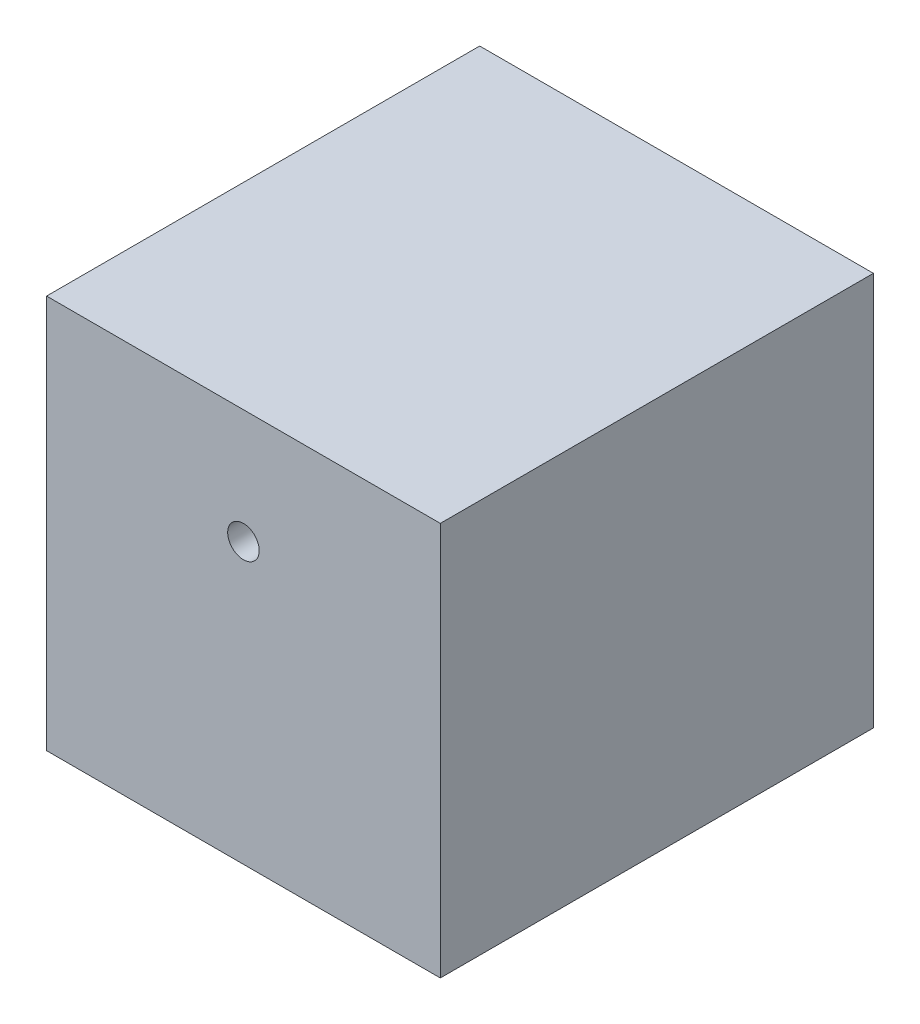
ISO-10303-21;
HEADER;
FILE_DESCRIPTION(('STEP AP214'),'2;1');
FILE_NAME('part.step','',(''),(''),'','','');
FILE_SCHEMA(('AUTOMOTIVE_DESIGN { 1 0 10303 214 1 1 1 1 }'));
ENDSEC;
DATA;
#1=APPLICATION_CONTEXT('core data for automotive mechanical design processes');
#2=APPLICATION_PROTOCOL_DEFINITION('international standard','automotive_design',2000,#1);
#3=PRODUCT_CONTEXT('',#1,'mechanical');
#4=PRODUCT('Part','Part','',(#3));
#5=PRODUCT_RELATED_PRODUCT_CATEGORY('part','',(#4));
#6=PRODUCT_DEFINITION_FORMATION('','',#4);
#7=PRODUCT_DEFINITION_CONTEXT('part definition',#1,'design');
#8=PRODUCT_DEFINITION('design','',#6,#7);
#9=PRODUCT_DEFINITION_SHAPE('','',#8);
#10=(LENGTH_UNIT() NAMED_UNIT(*) SI_UNIT(.MILLI.,.METRE.));
#11=(NAMED_UNIT(*) PLANE_ANGLE_UNIT() SI_UNIT($,.RADIAN.));
#12=(NAMED_UNIT(*) SI_UNIT($,.STERADIAN.) SOLID_ANGLE_UNIT());
#13=UNCERTAINTY_MEASURE_WITH_UNIT(LENGTH_MEASURE(1.E-05),#10,'distance_accuracy_value','');
#14=(GEOMETRIC_REPRESENTATION_CONTEXT(3) GLOBAL_UNCERTAINTY_ASSIGNED_CONTEXT((#13)) GLOBAL_UNIT_ASSIGNED_CONTEXT((#10,
#11,#12)) REPRESENTATION_CONTEXT('',''));
#15=CARTESIAN_POINT('',(0.,0.,0.));
#16=DIRECTION('',(0.,0.,1.));
#17=DIRECTION('',(1.,0.,0.));
#18=AXIS2_PLACEMENT_3D('',#15,#16,#17);
#19=CARTESIAN_POINT('',(0.,0.,11.));
#20=DIRECTION('',(1.,0.,0.));
#21=DIRECTION('',(0.,0.,-1.));
#22=AXIS2_PLACEMENT_3D('',#19,#20,#21);
#23=PLANE('',#22);
#24=DIRECTION('',(0.,-1.,0.));
#25=VECTOR('',#24,1.);
#26=CARTESIAN_POINT('',(0.,0.,0.));
#27=LINE('',#26,#25);
#28=CARTESIAN_POINT('',(0.,10.,0.));
#29=VERTEX_POINT('',#28);
#30=CARTESIAN_POINT('',(0.,0.,0.));
#31=VERTEX_POINT('',#30);
#32=EDGE_CURVE('E107',#29,#31,#27,.T.);
#33=ORIENTED_EDGE('',*,*,#32,.T.);
#34=DIRECTION('',(0.,0.,-1.));
#35=VECTOR('',#34,1.);
#36=CARTESIAN_POINT('',(0.,0.,11.));
#37=LINE('',#36,#35);
#38=CARTESIAN_POINT('',(0.,0.,11.));
#39=VERTEX_POINT('',#38);
#40=EDGE_CURVE('E11',#39,#31,#37,.T.);
#41=ORIENTED_EDGE('',*,*,#40,.F.);
#42=DIRECTION('',(0.,-1.,0.));
#43=VECTOR('',#42,1.);
#44=CARTESIAN_POINT('',(0.,0.,11.));
#45=LINE('',#44,#43);
#46=CARTESIAN_POINT('',(0.,10.,11.));
#47=VERTEX_POINT('',#46);
#48=EDGE_CURVE('E91',#47,#39,#45,.T.);
#49=ORIENTED_EDGE('',*,*,#48,.F.);
#50=DIRECTION('',(0.,0.,-1.));
#51=VECTOR('',#50,1.);
#52=CARTESIAN_POINT('',(0.,10.,11.));
#53=LINE('',#52,#51);
#54=EDGE_CURVE('E103',#47,#29,#53,.T.);
#55=ORIENTED_EDGE('',*,*,#54,.T.);
#56=EDGE_LOOP('',(#33,#41,#49,#55));
#57=FACE_BOUND('',#56,.T.);
#58=ADVANCED_FACE('F39',(#57),#23,.F.);
#59=CARTESIAN_POINT('',(0.,0.,11.));
#60=DIRECTION('',(0.,1.,0.));
#61=DIRECTION('',(0.,0.,1.));
#62=AXIS2_PLACEMENT_3D('',#59,#60,#61);
#63=PLANE('',#62);
#64=DIRECTION('',(1.,0.,0.));
#65=VECTOR('',#64,1.);
#66=CARTESIAN_POINT('',(0.,0.,0.));
#67=LINE('',#66,#65);
#68=CARTESIAN_POINT('',(10.,0.,0.));
#69=VERTEX_POINT('',#68);
#70=EDGE_CURVE('E96',#31,#69,#67,.T.);
#71=ORIENTED_EDGE('',*,*,#70,.T.);
#72=DIRECTION('',(0.,0.,-1.));
#73=VECTOR('',#72,1.);
#74=CARTESIAN_POINT('',(10.,0.,11.));
#75=LINE('',#74,#73);
#76=CARTESIAN_POINT('',(10.,0.,11.));
#77=VERTEX_POINT('',#76);
#78=EDGE_CURVE('E48',#77,#69,#75,.T.);
#79=ORIENTED_EDGE('',*,*,#78,.F.);
#80=DIRECTION('',(1.,0.,0.));
#81=VECTOR('',#80,1.);
#82=CARTESIAN_POINT('',(0.,0.,11.));
#83=LINE('',#82,#81);
#84=EDGE_CURVE('E86',#39,#77,#83,.T.);
#85=ORIENTED_EDGE('',*,*,#84,.F.);
#86=ORIENTED_EDGE('',*,*,#40,.T.);
#87=EDGE_LOOP('',(#71,#79,#85,#86));
#88=FACE_BOUND('',#87,.T.);
#89=ADVANCED_FACE('F95',(#88),#63,.F.);
#90=CARTESIAN_POINT('',(10.,0.,11.));
#91=DIRECTION('',(-1.,0.,0.));
#92=DIRECTION('',(0.,0.,1.));
#93=AXIS2_PLACEMENT_3D('',#90,#91,#92);
#94=PLANE('',#93);
#95=DIRECTION('',(0.,1.,0.));
#96=VECTOR('',#95,1.);
#97=CARTESIAN_POINT('',(10.,0.,0.));
#98=LINE('',#97,#96);
#99=CARTESIAN_POINT('',(10.,10.,0.));
#100=VERTEX_POINT('',#99);
#101=EDGE_CURVE('E73',#69,#100,#98,.T.);
#102=ORIENTED_EDGE('',*,*,#101,.T.);
#103=DIRECTION('',(0.,0.,-1.));
#104=VECTOR('',#103,1.);
#105=CARTESIAN_POINT('',(10.,10.,11.));
#106=LINE('',#105,#104);
#107=CARTESIAN_POINT('',(10.,10.,11.));
#108=VERTEX_POINT('',#107);
#109=EDGE_CURVE('E98',#108,#100,#106,.T.);
#110=ORIENTED_EDGE('',*,*,#109,.F.);
#111=DIRECTION('',(0.,1.,0.));
#112=VECTOR('',#111,1.);
#113=CARTESIAN_POINT('',(10.,0.,11.));
#114=LINE('',#113,#112);
#115=EDGE_CURVE('E89',#77,#108,#114,.T.);
#116=ORIENTED_EDGE('',*,*,#115,.F.);
#117=ORIENTED_EDGE('',*,*,#78,.T.);
#118=EDGE_LOOP('',(#102,#110,#116,#117));
#119=FACE_BOUND('',#118,.T.);
#120=ADVANCED_FACE('F99',(#119),#94,.F.);
#121=CARTESIAN_POINT('',(0.,10.,11.));
#122=DIRECTION('',(0.,-1.,0.));
#123=DIRECTION('',(0.,0.,-1.));
#124=AXIS2_PLACEMENT_3D('',#121,#122,#123);
#125=PLANE('',#124);
#126=DIRECTION('',(-1.,0.,0.));
#127=VECTOR('',#126,1.);
#128=CARTESIAN_POINT('',(0.,10.,0.));
#129=LINE('',#128,#127);
#130=EDGE_CURVE('E79',#100,#29,#129,.T.);
#131=ORIENTED_EDGE('',*,*,#130,.T.);
#132=ORIENTED_EDGE('',*,*,#54,.F.);
#133=DIRECTION('',(-1.,0.,0.));
#134=VECTOR('',#133,1.);
#135=CARTESIAN_POINT('',(0.,10.,11.));
#136=LINE('',#135,#134);
#137=EDGE_CURVE('E56',#108,#47,#136,.T.);
#138=ORIENTED_EDGE('',*,*,#137,.F.);
#139=ORIENTED_EDGE('',*,*,#109,.T.);
#140=EDGE_LOOP('',(#131,#132,#138,#139));
#141=FACE_BOUND('',#140,.T.);
#142=ADVANCED_FACE('F121',(#141),#125,.F.);
#143=CARTESIAN_POINT('',(0.,0.,11.));
#144=DIRECTION('',(0.,0.,-1.));
#145=DIRECTION('',(-1.,0.,0.));
#146=AXIS2_PLACEMENT_3D('',#143,#144,#145);
#147=PLANE('',#146);
#148=CARTESIAN_POINT('',(5.,7.1,11.));
#149=DIRECTION('',(0.,0.,1.));
#150=DIRECTION('',(1.,0.,0.));
#151=AXIS2_PLACEMENT_3D('',#148,#149,#150);
#152=CIRCLE('',#151,0.4);
#153=CARTESIAN_POINT('',(5.4,7.1,11.));
#154=VERTEX_POINT('',#153);
#155=EDGE_CURVE('E128',#154,#154,#152,.T.);
#156=ORIENTED_EDGE('',*,*,#155,.F.);
#157=EDGE_LOOP('',(#156));
#158=FACE_BOUND('',#157,.T.);
#159=ORIENTED_EDGE('',*,*,#48,.T.);
#160=ORIENTED_EDGE('',*,*,#84,.T.);
#161=ORIENTED_EDGE('',*,*,#115,.T.);
#162=ORIENTED_EDGE('',*,*,#137,.T.);
#163=EDGE_LOOP('',(#159,#160,#161,#162));
#164=FACE_BOUND('',#163,.T.);
#165=ADVANCED_FACE('F87',(#158,#164),#147,.F.);
#166=CARTESIAN_POINT('',(0.,0.,0.));
#167=DIRECTION('',(0.,0.,-1.));
#168=DIRECTION('',(-1.,0.,0.));
#169=AXIS2_PLACEMENT_3D('',#166,#167,#168);
#170=PLANE('',#169);
#171=ORIENTED_EDGE('',*,*,#32,.F.);
#172=ORIENTED_EDGE('',*,*,#130,.F.);
#173=ORIENTED_EDGE('',*,*,#101,.F.);
#174=ORIENTED_EDGE('',*,*,#70,.F.);
#175=EDGE_LOOP('',(#171,#172,#173,#174));
#176=FACE_BOUND('',#175,.T.);
#177=ADVANCED_FACE('F124',(#176),#170,.T.);
#178=CARTESIAN_POINT('',(5.,7.1,4.));
#179=DIRECTION('',(0.,0.,1.));
#180=DIRECTION('',(1.,0.,0.));
#181=AXIS2_PLACEMENT_3D('',#178,#179,#180);
#182=CYLINDRICAL_SURFACE('',#181,0.4);
#183=CARTESIAN_POINT('',(5.,7.1,4.));
#184=DIRECTION('',(0.,0.,1.));
#185=DIRECTION('',(1.,0.,0.));
#186=AXIS2_PLACEMENT_3D('',#183,#184,#185);
#187=CIRCLE('',#186,0.4);
#188=CARTESIAN_POINT('',(5.4,7.1,4.));
#189=VERTEX_POINT('',#188);
#190=EDGE_CURVE('E111',#189,#189,#187,.T.);
#191=ORIENTED_EDGE('',*,*,#190,.F.);
#192=EDGE_LOOP('',(#191));
#193=FACE_BOUND('',#192,.T.);
#194=ORIENTED_EDGE('',*,*,#155,.T.);
#195=EDGE_LOOP('',(#194));
#196=FACE_BOUND('',#195,.T.);
#197=ADVANCED_FACE('F138',(#193,#196),#182,.F.);
#198=CARTESIAN_POINT('',(5.,7.1,4.));
#199=DIRECTION('',(0.,0.,1.));
#200=DIRECTION('',(1.,0.,0.));
#201=AXIS2_PLACEMENT_3D('',#198,#199,#200);
#202=PLANE('',#201);
#203=ORIENTED_EDGE('',*,*,#190,.T.);
#204=EDGE_LOOP('',(#203));
#205=FACE_BOUND('',#204,.T.);
#206=ADVANCED_FACE('F136',(#205),#202,.T.);
#207=CLOSED_SHELL('',(#58,#89,#120,#142,#165,#177,#197,#206));
#208=MANIFOLD_SOLID_BREP('B2',#207);
#209=ADVANCED_BREP_SHAPE_REPRESENTATION('',(#18,#208),#14);
#210=SHAPE_DEFINITION_REPRESENTATION(#9,#209);
ENDSEC;
END-ISO-10303-21;
